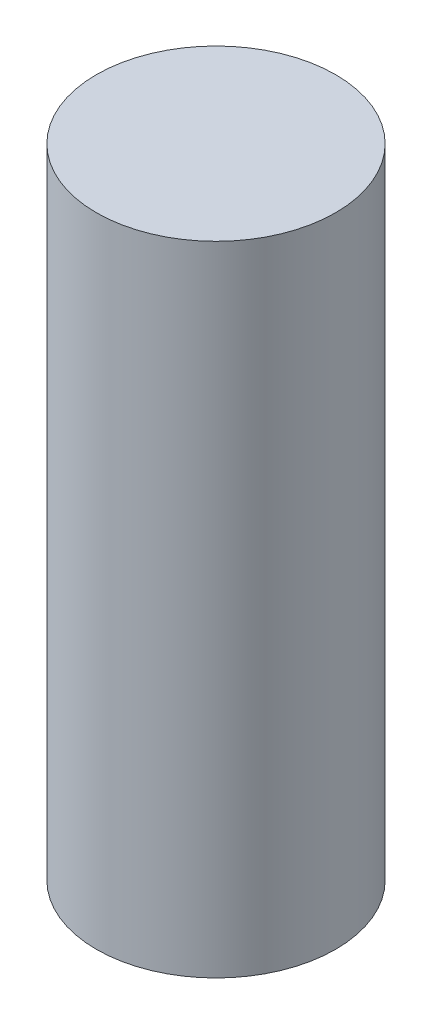
ISO-10303-21;
HEADER;
FILE_DESCRIPTION(('STEP AP214'),'2;1');
FILE_NAME('part.step','',(''),(''),'','','');
FILE_SCHEMA(('AUTOMOTIVE_DESIGN { 1 0 10303 214 1 1 1 1 }'));
ENDSEC;
DATA;
#1=APPLICATION_CONTEXT('core data for automotive mechanical design processes');
#2=APPLICATION_PROTOCOL_DEFINITION('international standard','automotive_design',2000,#1);
#3=PRODUCT_CONTEXT('',#1,'mechanical');
#4=PRODUCT('Part','Part','',(#3));
#5=PRODUCT_RELATED_PRODUCT_CATEGORY('part','',(#4));
#6=PRODUCT_DEFINITION_FORMATION('','',#4);
#7=PRODUCT_DEFINITION_CONTEXT('part definition',#1,'design');
#8=PRODUCT_DEFINITION('design','',#6,#7);
#9=PRODUCT_DEFINITION_SHAPE('','',#8);
#10=(LENGTH_UNIT() NAMED_UNIT(*) SI_UNIT(.MILLI.,.METRE.));
#11=(NAMED_UNIT(*) PLANE_ANGLE_UNIT() SI_UNIT($,.RADIAN.));
#12=(NAMED_UNIT(*) SI_UNIT($,.STERADIAN.) SOLID_ANGLE_UNIT());
#13=UNCERTAINTY_MEASURE_WITH_UNIT(LENGTH_MEASURE(1.E-05),#10,'distance_accuracy_value','');
#14=(GEOMETRIC_REPRESENTATION_CONTEXT(3) GLOBAL_UNCERTAINTY_ASSIGNED_CONTEXT((#13)) GLOBAL_UNIT_ASSIGNED_CONTEXT((#10,
#11,#12)) REPRESENTATION_CONTEXT('',''));
#15=CARTESIAN_POINT('',(0.,0.,0.));
#16=DIRECTION('',(0.,0.,1.));
#17=DIRECTION('',(1.,0.,0.));
#18=AXIS2_PLACEMENT_3D('',#15,#16,#17);
#19=CARTESIAN_POINT('',(0.,2.,0.));
#20=DIRECTION('',(0.,-1.,0.));
#21=DIRECTION('',(0.,0.,-1.));
#22=AXIS2_PLACEMENT_3D('',#19,#20,#21);
#23=CYLINDRICAL_SURFACE('',#22,0.375);
#24=CARTESIAN_POINT('',(0.,2.,0.));
#25=DIRECTION('',(0.,1.,0.));
#26=DIRECTION('',(0.,0.,1.));
#27=AXIS2_PLACEMENT_3D('',#24,#25,#26);
#28=CIRCLE('',#27,0.375);
#29=CARTESIAN_POINT('',(0.,2.,0.375));
#30=VERTEX_POINT('',#29);
#31=EDGE_CURVE('E10',#30,#30,#28,.T.);
#32=ORIENTED_EDGE('',*,*,#31,.F.);
#33=EDGE_LOOP('',(#32));
#34=FACE_BOUND('',#33,.T.);
#35=CARTESIAN_POINT('',(0.,0.,0.));
#36=DIRECTION('',(0.,1.,0.));
#37=DIRECTION('',(0.,0.,1.));
#38=AXIS2_PLACEMENT_3D('',#35,#36,#37);
#39=CIRCLE('',#38,0.375);
#40=CARTESIAN_POINT('',(0.,0.,0.375));
#41=VERTEX_POINT('',#40);
#42=EDGE_CURVE('E34',#41,#41,#39,.T.);
#43=ORIENTED_EDGE('',*,*,#42,.T.);
#44=EDGE_LOOP('',(#43));
#45=FACE_BOUND('',#44,.T.);
#46=ADVANCED_FACE('F31',(#34,#45),#23,.T.);
#47=CARTESIAN_POINT('',(0.,2.,0.));
#48=DIRECTION('',(0.,1.,0.));
#49=DIRECTION('',(0.,0.,1.));
#50=AXIS2_PLACEMENT_3D('',#47,#48,#49);
#51=PLANE('',#50);
#52=ORIENTED_EDGE('',*,*,#31,.T.);
#53=EDGE_LOOP('',(#52));
#54=FACE_BOUND('',#53,.T.);
#55=ADVANCED_FACE('F46',(#54),#51,.T.);
#56=CARTESIAN_POINT('',(0.,0.,0.));
#57=DIRECTION('',(0.,1.,0.));
#58=DIRECTION('',(0.,0.,1.));
#59=AXIS2_PLACEMENT_3D('',#56,#57,#58);
#60=PLANE('',#59);
#61=ORIENTED_EDGE('',*,*,#42,.F.);
#62=EDGE_LOOP('',(#61));
#63=FACE_BOUND('',#62,.T.);
#64=ADVANCED_FACE('F44',(#63),#60,.F.);
#65=CLOSED_SHELL('',(#46,#55,#64));
#66=MANIFOLD_SOLID_BREP('B2',#65);
#67=ADVANCED_BREP_SHAPE_REPRESENTATION('',(#18,#66),#14);
#68=SHAPE_DEFINITION_REPRESENTATION(#9,#67);
ENDSEC;
END-ISO-10303-21;
